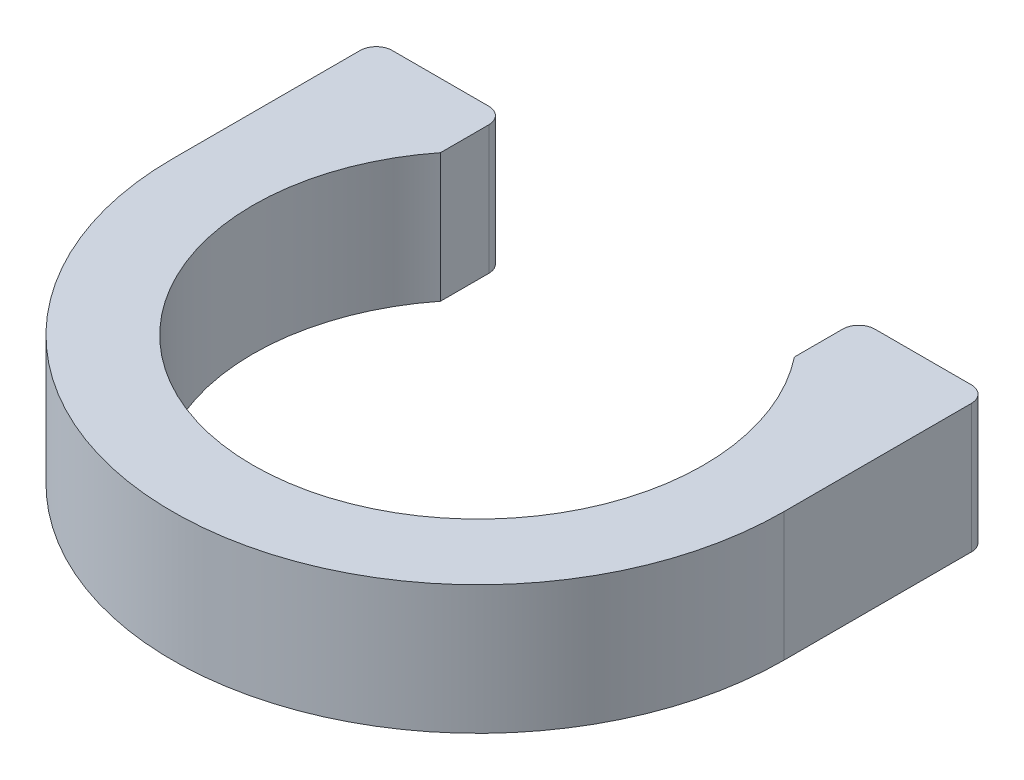
ISO-10303-21;
HEADER;
FILE_DESCRIPTION(('STEP AP214'),'2;1');
FILE_NAME('part.step','',(''),(''),'','','');
FILE_SCHEMA(('AUTOMOTIVE_DESIGN { 1 0 10303 214 1 1 1 1 }'));
ENDSEC;
DATA;
#1=APPLICATION_CONTEXT('core data for automotive mechanical design processes');
#2=APPLICATION_PROTOCOL_DEFINITION('international standard','automotive_design',2000,#1);
#3=PRODUCT_CONTEXT('',#1,'mechanical');
#4=PRODUCT('Part','Part','',(#3));
#5=PRODUCT_RELATED_PRODUCT_CATEGORY('part','',(#4));
#6=PRODUCT_DEFINITION_FORMATION('','',#4);
#7=PRODUCT_DEFINITION_CONTEXT('part definition',#1,'design');
#8=PRODUCT_DEFINITION('design','',#6,#7);
#9=PRODUCT_DEFINITION_SHAPE('','',#8);
#10=(LENGTH_UNIT() NAMED_UNIT(*) SI_UNIT(.MILLI.,.METRE.));
#11=(NAMED_UNIT(*) PLANE_ANGLE_UNIT() SI_UNIT($,.RADIAN.));
#12=(NAMED_UNIT(*) SI_UNIT($,.STERADIAN.) SOLID_ANGLE_UNIT());
#13=UNCERTAINTY_MEASURE_WITH_UNIT(LENGTH_MEASURE(1.E-05),#10,'distance_accuracy_value','');
#14=(GEOMETRIC_REPRESENTATION_CONTEXT(3) GLOBAL_UNCERTAINTY_ASSIGNED_CONTEXT((#13)) GLOBAL_UNIT_ASSIGNED_CONTEXT((#10,
#11,#12)) REPRESENTATION_CONTEXT('',''));
#15=CARTESIAN_POINT('',(0.,0.,0.));
#16=DIRECTION('',(0.,0.,1.));
#17=DIRECTION('',(1.,0.,0.));
#18=AXIS2_PLACEMENT_3D('',#15,#16,#17);
#19=CARTESIAN_POINT('',(-6.,4.,-7.4150635094611));
#20=DIRECTION('',(0.,-1.,0.));
#21=DIRECTION('',(0.,0.,-1.));
#22=AXIS2_PLACEMENT_3D('',#19,#20,#21);
#23=CYLINDRICAL_SURFACE('',#22,0.5);
#24=CARTESIAN_POINT('',(-6.,0.,-7.4150635094611));
#25=DIRECTION('',(0.,1.,0.));
#26=DIRECTION('',(0.,0.,1.));
#27=AXIS2_PLACEMENT_3D('',#24,#25,#26);
#28=CIRCLE('',#27,0.5);
#29=CARTESIAN_POINT('',(-6.,0.,-7.9150635094611));
#30=VERTEX_POINT('',#29);
#31=CARTESIAN_POINT('',(-5.5,0.,-7.41506350946109));
#32=VERTEX_POINT('',#31);
#33=EDGE_CURVE('E154',#30,#32,#28,.F.);
#34=ORIENTED_EDGE('',*,*,#33,.F.);
#35=DIRECTION('',(0.,-1.,0.));
#36=VECTOR('',#35,1.);
#37=CARTESIAN_POINT('',(-6.,4.,-7.9150635094611));
#38=LINE('',#37,#36);
#39=CARTESIAN_POINT('',(-6.,4.,-7.9150635094611));
#40=VERTEX_POINT('',#39);
#41=EDGE_CURVE('E11',#40,#30,#38,.T.);
#42=ORIENTED_EDGE('',*,*,#41,.F.);
#43=CARTESIAN_POINT('',(-6.,4.,-7.4150635094611));
#44=DIRECTION('',(0.,1.,0.));
#45=DIRECTION('',(0.,0.,1.));
#46=AXIS2_PLACEMENT_3D('',#43,#44,#45);
#47=CIRCLE('',#46,0.5);
#48=CARTESIAN_POINT('',(-5.5,4.,-7.41506350946109));
#49=VERTEX_POINT('',#48);
#50=EDGE_CURVE('E183',#40,#49,#47,.F.);
#51=ORIENTED_EDGE('',*,*,#50,.T.);
#52=DIRECTION('',(0.,-1.,0.));
#53=VECTOR('',#52,1.);
#54=CARTESIAN_POINT('',(-5.5,4.,-7.41506350946109));
#55=LINE('',#54,#53);
#56=EDGE_CURVE('E51',#49,#32,#55,.T.);
#57=ORIENTED_EDGE('',*,*,#56,.T.);
#58=EDGE_LOOP('',(#34,#42,#51,#57));
#59=FACE_BOUND('',#58,.T.);
#60=ADVANCED_FACE('F35',(#59),#23,.T.);
#61=CARTESIAN_POINT('',(0.,4.,-7.9150635094611));
#62=DIRECTION('',(0.,0.,1.));
#63=DIRECTION('',(1.,0.,0.));
#64=AXIS2_PLACEMENT_3D('',#61,#62,#63);
#65=PLANE('',#64);
#66=DIRECTION('',(-1.,0.,0.));
#67=VECTOR('',#66,1.);
#68=CARTESIAN_POINT('',(0.,0.,-7.9150635094611));
#69=LINE('',#68,#67);
#70=CARTESIAN_POINT('',(-9.,0.,-7.9150635094611));
#71=VERTEX_POINT('',#70);
#72=EDGE_CURVE('E156',#30,#71,#69,.T.);
#73=ORIENTED_EDGE('',*,*,#72,.T.);
#74=DIRECTION('',(0.,-1.,0.));
#75=VECTOR('',#74,1.);
#76=CARTESIAN_POINT('',(-9.,4.,-7.9150635094611));
#77=LINE('',#76,#75);
#78=CARTESIAN_POINT('',(-9.,4.,-7.9150635094611));
#79=VERTEX_POINT('',#78);
#80=EDGE_CURVE('E43',#79,#71,#77,.T.);
#81=ORIENTED_EDGE('',*,*,#80,.F.);
#82=DIRECTION('',(-1.,0.,0.));
#83=VECTOR('',#82,1.);
#84=CARTESIAN_POINT('',(0.,4.,-7.9150635094611));
#85=LINE('',#84,#83);
#86=EDGE_CURVE('E365',#40,#79,#85,.T.);
#87=ORIENTED_EDGE('',*,*,#86,.F.);
#88=ORIENTED_EDGE('',*,*,#41,.T.);
#89=EDGE_LOOP('',(#73,#81,#87,#88));
#90=FACE_BOUND('',#89,.T.);
#91=ADVANCED_FACE('F209',(#90),#65,.F.);
#92=CARTESIAN_POINT('',(-9.,4.,-7.4150635094611));
#93=DIRECTION('',(0.,-1.,0.));
#94=DIRECTION('',(0.,0.,-1.));
#95=AXIS2_PLACEMENT_3D('',#92,#93,#94);
#96=CYLINDRICAL_SURFACE('',#95,0.5);
#97=CARTESIAN_POINT('',(-9.,0.,-7.4150635094611));
#98=DIRECTION('',(0.,1.,0.));
#99=DIRECTION('',(0.,0.,1.));
#100=AXIS2_PLACEMENT_3D('',#97,#98,#99);
#101=CIRCLE('',#100,0.5);
#102=CARTESIAN_POINT('',(-9.5,0.,-7.41506350946109));
#103=VERTEX_POINT('',#102);
#104=EDGE_CURVE('E159',#103,#71,#101,.F.);
#105=ORIENTED_EDGE('',*,*,#104,.F.);
#106=DIRECTION('',(0.,-1.,0.));
#107=VECTOR('',#106,1.);
#108=CARTESIAN_POINT('',(-9.5,4.,-7.41506350946109));
#109=LINE('',#108,#107);
#110=CARTESIAN_POINT('',(-9.5,4.,-7.41506350946109));
#111=VERTEX_POINT('',#110);
#112=EDGE_CURVE('E199',#111,#103,#109,.T.);
#113=ORIENTED_EDGE('',*,*,#112,.F.);
#114=CARTESIAN_POINT('',(-9.,4.,-7.4150635094611));
#115=DIRECTION('',(0.,1.,0.));
#116=DIRECTION('',(0.,0.,1.));
#117=AXIS2_PLACEMENT_3D('',#114,#115,#116);
#118=CIRCLE('',#117,0.5);
#119=EDGE_CURVE('E206',#111,#79,#118,.F.);
#120=ORIENTED_EDGE('',*,*,#119,.T.);
#121=ORIENTED_EDGE('',*,*,#80,.T.);
#122=EDGE_LOOP('',(#105,#113,#120,#121));
#123=FACE_BOUND('',#122,.T.);
#124=ADVANCED_FACE('F204',(#123),#96,.T.);
#125=CARTESIAN_POINT('',(-9.5,4.,0.));
#126=DIRECTION('',(1.,0.,0.));
#127=DIRECTION('',(0.,0.,-1.));
#128=AXIS2_PLACEMENT_3D('',#125,#126,#127);
#129=PLANE('',#128);
#130=DIRECTION('',(0.,0.,1.));
#131=VECTOR('',#130,1.);
#132=CARTESIAN_POINT('',(-9.5,0.,0.));
#133=LINE('',#132,#131);
#134=CARTESIAN_POINT('',(-9.5,0.,-1.5849364905389));
#135=VERTEX_POINT('',#134);
#136=EDGE_CURVE('E162',#103,#135,#133,.T.);
#137=ORIENTED_EDGE('',*,*,#136,.T.);
#138=DIRECTION('',(0.,-1.,0.));
#139=VECTOR('',#138,1.);
#140=CARTESIAN_POINT('',(-9.5,4.,-1.5849364905389));
#141=LINE('',#140,#139);
#142=CARTESIAN_POINT('',(-9.5,4.,-1.5849364905389));
#143=VERTEX_POINT('',#142);
#144=EDGE_CURVE('E196',#143,#135,#141,.T.);
#145=ORIENTED_EDGE('',*,*,#144,.F.);
#146=DIRECTION('',(0.,0.,1.));
#147=VECTOR('',#146,1.);
#148=CARTESIAN_POINT('',(-9.5,4.,0.));
#149=LINE('',#148,#147);
#150=EDGE_CURVE('E226',#111,#143,#149,.T.);
#151=ORIENTED_EDGE('',*,*,#150,.F.);
#152=ORIENTED_EDGE('',*,*,#112,.T.);
#153=EDGE_LOOP('',(#137,#145,#151,#152));
#154=FACE_BOUND('',#153,.T.);
#155=ADVANCED_FACE('F217',(#154),#129,.F.);
#156=CARTESIAN_POINT('',(0.,4.,-1.5849364905389));
#157=DIRECTION('',(0.,-1.,0.));
#158=DIRECTION('',(0.,0.,-1.));
#159=AXIS2_PLACEMENT_3D('',#156,#157,#158);
#160=CYLINDRICAL_SURFACE('',#159,9.5);
#161=CARTESIAN_POINT('',(0.,0.,-1.5849364905389));
#162=DIRECTION('',(0.,1.,0.));
#163=DIRECTION('',(0.,0.,1.));
#164=AXIS2_PLACEMENT_3D('',#161,#162,#163);
#165=CIRCLE('',#164,9.5);
#166=CARTESIAN_POINT('',(9.5,0.,-1.5849364905389));
#167=VERTEX_POINT('',#166);
#168=EDGE_CURVE('E164',#135,#167,#165,.T.);
#169=ORIENTED_EDGE('',*,*,#168,.T.);
#170=DIRECTION('',(0.,-1.,0.));
#171=VECTOR('',#170,1.);
#172=CARTESIAN_POINT('',(9.5,4.,-1.5849364905389));
#173=LINE('',#172,#171);
#174=CARTESIAN_POINT('',(9.5,4.,-1.5849364905389));
#175=VERTEX_POINT('',#174);
#176=EDGE_CURVE('E193',#175,#167,#173,.T.);
#177=ORIENTED_EDGE('',*,*,#176,.F.);
#178=CARTESIAN_POINT('',(0.,4.,-1.5849364905389));
#179=DIRECTION('',(0.,1.,0.));
#180=DIRECTION('',(0.,0.,1.));
#181=AXIS2_PLACEMENT_3D('',#178,#179,#180);
#182=CIRCLE('',#181,9.5);
#183=EDGE_CURVE('E223',#143,#175,#182,.T.);
#184=ORIENTED_EDGE('',*,*,#183,.F.);
#185=ORIENTED_EDGE('',*,*,#144,.T.);
#186=EDGE_LOOP('',(#169,#177,#184,#185));
#187=FACE_BOUND('',#186,.T.);
#188=ADVANCED_FACE('F221',(#187),#160,.T.);
#189=CARTESIAN_POINT('',(9.5,4.,0.));
#190=DIRECTION('',(-1.,0.,0.));
#191=DIRECTION('',(0.,0.,1.));
#192=AXIS2_PLACEMENT_3D('',#189,#190,#191);
#193=PLANE('',#192);
#194=DIRECTION('',(0.,0.,-1.));
#195=VECTOR('',#194,1.);
#196=CARTESIAN_POINT('',(9.5,0.,0.));
#197=LINE('',#196,#195);
#198=CARTESIAN_POINT('',(9.5,0.,-7.41506350946109));
#199=VERTEX_POINT('',#198);
#200=EDGE_CURVE('E166',#167,#199,#197,.T.);
#201=ORIENTED_EDGE('',*,*,#200,.T.);
#202=DIRECTION('',(0.,-1.,0.));
#203=VECTOR('',#202,1.);
#204=CARTESIAN_POINT('',(9.5,4.,-7.41506350946109));
#205=LINE('',#204,#203);
#206=CARTESIAN_POINT('',(9.5,4.,-7.41506350946109));
#207=VERTEX_POINT('',#206);
#208=EDGE_CURVE('E191',#207,#199,#205,.T.);
#209=ORIENTED_EDGE('',*,*,#208,.F.);
#210=DIRECTION('',(0.,0.,-1.));
#211=VECTOR('',#210,1.);
#212=CARTESIAN_POINT('',(9.5,4.,0.));
#213=LINE('',#212,#211);
#214=EDGE_CURVE('E225',#175,#207,#213,.T.);
#215=ORIENTED_EDGE('',*,*,#214,.F.);
#216=ORIENTED_EDGE('',*,*,#176,.T.);
#217=EDGE_LOOP('',(#201,#209,#215,#216));
#218=FACE_BOUND('',#217,.T.);
#219=ADVANCED_FACE('F313',(#218),#193,.F.);
#220=CARTESIAN_POINT('',(9.,4.,-7.4150635094611));
#221=DIRECTION('',(0.,-1.,0.));
#222=DIRECTION('',(0.,0.,-1.));
#223=AXIS2_PLACEMENT_3D('',#220,#221,#222);
#224=CYLINDRICAL_SURFACE('',#223,0.5);
#225=CARTESIAN_POINT('',(9.,0.,-7.4150635094611));
#226=DIRECTION('',(0.,1.,0.));
#227=DIRECTION('',(0.,0.,1.));
#228=AXIS2_PLACEMENT_3D('',#225,#226,#227);
#229=CIRCLE('',#228,0.5);
#230=CARTESIAN_POINT('',(9.,0.,-7.9150635094611));
#231=VERTEX_POINT('',#230);
#232=EDGE_CURVE('E169',#231,#199,#229,.F.);
#233=ORIENTED_EDGE('',*,*,#232,.F.);
#234=DIRECTION('',(0.,-1.,0.));
#235=VECTOR('',#234,1.);
#236=CARTESIAN_POINT('',(9.,4.,-7.9150635094611));
#237=LINE('',#236,#235);
#238=CARTESIAN_POINT('',(9.,4.,-7.9150635094611));
#239=VERTEX_POINT('',#238);
#240=EDGE_CURVE('E189',#239,#231,#237,.T.);
#241=ORIENTED_EDGE('',*,*,#240,.F.);
#242=CARTESIAN_POINT('',(9.,4.,-7.4150635094611));
#243=DIRECTION('',(0.,1.,0.));
#244=DIRECTION('',(0.,0.,1.));
#245=AXIS2_PLACEMENT_3D('',#242,#243,#244);
#246=CIRCLE('',#245,0.5);
#247=EDGE_CURVE('E228',#239,#207,#246,.F.);
#248=ORIENTED_EDGE('',*,*,#247,.T.);
#249=ORIENTED_EDGE('',*,*,#208,.T.);
#250=EDGE_LOOP('',(#233,#241,#248,#249));
#251=FACE_BOUND('',#250,.T.);
#252=ADVANCED_FACE('F244',(#251),#224,.T.);
#253=CARTESIAN_POINT('',(0.,4.,-7.9150635094611));
#254=DIRECTION('',(0.,0.,-1.));
#255=DIRECTION('',(-1.,0.,0.));
#256=AXIS2_PLACEMENT_3D('',#253,#254,#255);
#257=PLANE('',#256);
#258=DIRECTION('',(1.,0.,0.));
#259=VECTOR('',#258,1.);
#260=CARTESIAN_POINT('',(0.,0.,-7.9150635094611));
#261=LINE('',#260,#259);
#262=CARTESIAN_POINT('',(6.,0.,-7.9150635094611));
#263=VERTEX_POINT('',#262);
#264=EDGE_CURVE('E172',#263,#231,#261,.T.);
#265=ORIENTED_EDGE('',*,*,#264,.F.);
#266=DIRECTION('',(0.,-1.,0.));
#267=VECTOR('',#266,1.);
#268=CARTESIAN_POINT('',(6.,4.,-7.9150635094611));
#269=LINE('',#268,#267);
#270=CARTESIAN_POINT('',(6.,4.,-7.9150635094611));
#271=VERTEX_POINT('',#270);
#272=EDGE_CURVE('E187',#271,#263,#269,.T.);
#273=ORIENTED_EDGE('',*,*,#272,.F.);
#274=DIRECTION('',(1.,0.,0.));
#275=VECTOR('',#274,1.);
#276=CARTESIAN_POINT('',(0.,4.,-7.9150635094611));
#277=LINE('',#276,#275);
#278=EDGE_CURVE('E235',#271,#239,#277,.T.);
#279=ORIENTED_EDGE('',*,*,#278,.T.);
#280=ORIENTED_EDGE('',*,*,#240,.T.);
#281=EDGE_LOOP('',(#265,#273,#279,#280));
#282=FACE_BOUND('',#281,.T.);
#283=ADVANCED_FACE('F239',(#282),#257,.T.);
#284=CARTESIAN_POINT('',(6.,4.,-7.4150635094611));
#285=DIRECTION('',(0.,-1.,0.));
#286=DIRECTION('',(0.,0.,-1.));
#287=AXIS2_PLACEMENT_3D('',#284,#285,#286);
#288=CYLINDRICAL_SURFACE('',#287,0.5);
#289=CARTESIAN_POINT('',(6.,0.,-7.4150635094611));
#290=DIRECTION('',(0.,1.,0.));
#291=DIRECTION('',(0.,0.,1.));
#292=AXIS2_PLACEMENT_3D('',#289,#290,#291);
#293=CIRCLE('',#292,0.5);
#294=CARTESIAN_POINT('',(5.5,0.,-7.41506350946109));
#295=VERTEX_POINT('',#294);
#296=EDGE_CURVE('E175',#263,#295,#293,.T.);
#297=ORIENTED_EDGE('',*,*,#296,.T.);
#298=DIRECTION('',(0.,-1.,0.));
#299=VECTOR('',#298,1.);
#300=CARTESIAN_POINT('',(5.5,4.,-7.41506350946109));
#301=LINE('',#300,#299);
#302=CARTESIAN_POINT('',(5.5,4.,-7.41506350946109));
#303=VERTEX_POINT('',#302);
#304=EDGE_CURVE('E146',#303,#295,#301,.T.);
#305=ORIENTED_EDGE('',*,*,#304,.F.);
#306=CARTESIAN_POINT('',(6.,4.,-7.4150635094611));
#307=DIRECTION('',(0.,1.,0.));
#308=DIRECTION('',(0.,0.,1.));
#309=AXIS2_PLACEMENT_3D('',#306,#307,#308);
#310=CIRCLE('',#309,0.5);
#311=EDGE_CURVE('E134',#271,#303,#310,.T.);
#312=ORIENTED_EDGE('',*,*,#311,.F.);
#313=ORIENTED_EDGE('',*,*,#272,.T.);
#314=EDGE_LOOP('',(#297,#305,#312,#313));
#315=FACE_BOUND('',#314,.T.);
#316=ADVANCED_FACE('F247',(#315),#288,.T.);
#317=CARTESIAN_POINT('',(5.5,4.,0.));
#318=DIRECTION('',(1.,0.,0.));
#319=DIRECTION('',(0.,0.,-1.));
#320=AXIS2_PLACEMENT_3D('',#317,#318,#319);
#321=PLANE('',#320);
#322=DIRECTION('',(0.,0.,1.));
#323=VECTOR('',#322,1.);
#324=CARTESIAN_POINT('',(5.5,0.,0.));
#325=LINE('',#324,#323);
#326=CARTESIAN_POINT('',(5.5,0.,-5.9150635094611));
#327=VERTEX_POINT('',#326);
#328=EDGE_CURVE('E143',#295,#327,#325,.T.);
#329=ORIENTED_EDGE('',*,*,#328,.T.);
#330=DIRECTION('',(0.,-1.,0.));
#331=VECTOR('',#330,1.);
#332=CARTESIAN_POINT('',(5.5,4.,-5.9150635094611));
#333=LINE('',#332,#331);
#334=CARTESIAN_POINT('',(5.5,4.,-5.9150635094611));
#335=VERTEX_POINT('',#334);
#336=EDGE_CURVE('E140',#335,#327,#333,.T.);
#337=ORIENTED_EDGE('',*,*,#336,.F.);
#338=DIRECTION('',(0.,0.,1.));
#339=VECTOR('',#338,1.);
#340=CARTESIAN_POINT('',(5.5,4.,0.));
#341=LINE('',#340,#339);
#342=EDGE_CURVE('E125',#303,#335,#341,.T.);
#343=ORIENTED_EDGE('',*,*,#342,.F.);
#344=ORIENTED_EDGE('',*,*,#304,.T.);
#345=EDGE_LOOP('',(#329,#337,#343,#344));
#346=FACE_BOUND('',#345,.T.);
#347=ADVANCED_FACE('F141',(#346),#321,.F.);
#348=CARTESIAN_POINT('',(0.,4.,-1.5849364905389));
#349=DIRECTION('',(0.,-1.,0.));
#350=DIRECTION('',(0.,0.,-1.));
#351=AXIS2_PLACEMENT_3D('',#348,#349,#350);
#352=CYLINDRICAL_SURFACE('',#351,7.);
#353=CARTESIAN_POINT('',(0.,0.,-1.5849364905389));
#354=DIRECTION('',(0.,1.,0.));
#355=DIRECTION('',(0.,0.,1.));
#356=AXIS2_PLACEMENT_3D('',#353,#354,#355);
#357=CIRCLE('',#356,7.);
#358=CARTESIAN_POINT('',(-5.5,0.,-5.9150635094611));
#359=VERTEX_POINT('',#358);
#360=EDGE_CURVE('E178',#359,#327,#357,.T.);
#361=ORIENTED_EDGE('',*,*,#360,.F.);
#362=DIRECTION('',(0.,-1.,0.));
#363=VECTOR('',#362,1.);
#364=CARTESIAN_POINT('',(-5.5,4.,-5.9150635094611));
#365=LINE('',#364,#363);
#366=CARTESIAN_POINT('',(-5.5,4.,-5.9150635094611));
#367=VERTEX_POINT('',#366);
#368=EDGE_CURVE('E88',#367,#359,#365,.T.);
#369=ORIENTED_EDGE('',*,*,#368,.F.);
#370=CARTESIAN_POINT('',(0.,4.,-1.5849364905389));
#371=DIRECTION('',(0.,1.,0.));
#372=DIRECTION('',(0.,0.,1.));
#373=AXIS2_PLACEMENT_3D('',#370,#371,#372);
#374=CIRCLE('',#373,7.);
#375=EDGE_CURVE('E131',#367,#335,#374,.T.);
#376=ORIENTED_EDGE('',*,*,#375,.T.);
#377=ORIENTED_EDGE('',*,*,#336,.T.);
#378=EDGE_LOOP('',(#361,#369,#376,#377));
#379=FACE_BOUND('',#378,.T.);
#380=ADVANCED_FACE('F148',(#379),#352,.F.);
#381=CARTESIAN_POINT('',(-5.5,4.,0.));
#382=DIRECTION('',(1.,0.,0.));
#383=DIRECTION('',(0.,0.,-1.));
#384=AXIS2_PLACEMENT_3D('',#381,#382,#383);
#385=PLANE('',#384);
#386=DIRECTION('',(0.,0.,1.));
#387=VECTOR('',#386,1.);
#388=CARTESIAN_POINT('',(-5.5,0.,0.));
#389=LINE('',#388,#387);
#390=EDGE_CURVE('E180',#32,#359,#389,.T.);
#391=ORIENTED_EDGE('',*,*,#390,.F.);
#392=ORIENTED_EDGE('',*,*,#56,.F.);
#393=DIRECTION('',(0.,0.,1.));
#394=VECTOR('',#393,1.);
#395=CARTESIAN_POINT('',(-5.5,4.,0.));
#396=LINE('',#395,#394);
#397=EDGE_CURVE('E149',#49,#367,#396,.T.);
#398=ORIENTED_EDGE('',*,*,#397,.T.);
#399=ORIENTED_EDGE('',*,*,#368,.T.);
#400=EDGE_LOOP('',(#391,#392,#398,#399));
#401=FACE_BOUND('',#400,.T.);
#402=ADVANCED_FACE('F260',(#401),#385,.T.);
#403=CARTESIAN_POINT('',(0.,4.,0.));
#404=DIRECTION('',(0.,1.,0.));
#405=DIRECTION('',(0.,0.,1.));
#406=AXIS2_PLACEMENT_3D('',#403,#404,#405);
#407=PLANE('',#406);
#408=ORIENTED_EDGE('',*,*,#50,.F.);
#409=ORIENTED_EDGE('',*,*,#86,.T.);
#410=ORIENTED_EDGE('',*,*,#119,.F.);
#411=ORIENTED_EDGE('',*,*,#150,.T.);
#412=ORIENTED_EDGE('',*,*,#183,.T.);
#413=ORIENTED_EDGE('',*,*,#214,.T.);
#414=ORIENTED_EDGE('',*,*,#247,.F.);
#415=ORIENTED_EDGE('',*,*,#278,.F.);
#416=ORIENTED_EDGE('',*,*,#311,.T.);
#417=ORIENTED_EDGE('',*,*,#342,.T.);
#418=ORIENTED_EDGE('',*,*,#375,.F.);
#419=ORIENTED_EDGE('',*,*,#397,.F.);
#420=EDGE_LOOP('',(#408,#409,#410,#411,#412,#413,#414,#415,#416,#417,#418,#419));
#421=FACE_BOUND('',#420,.T.);
#422=ADVANCED_FACE('F128',(#421),#407,.T.);
#423=CARTESIAN_POINT('',(0.,0.,0.));
#424=DIRECTION('',(0.,1.,0.));
#425=DIRECTION('',(0.,0.,1.));
#426=AXIS2_PLACEMENT_3D('',#423,#424,#425);
#427=PLANE('',#426);
#428=ORIENTED_EDGE('',*,*,#33,.T.);
#429=ORIENTED_EDGE('',*,*,#390,.T.);
#430=ORIENTED_EDGE('',*,*,#360,.T.);
#431=ORIENTED_EDGE('',*,*,#328,.F.);
#432=ORIENTED_EDGE('',*,*,#296,.F.);
#433=ORIENTED_EDGE('',*,*,#264,.T.);
#434=ORIENTED_EDGE('',*,*,#232,.T.);
#435=ORIENTED_EDGE('',*,*,#200,.F.);
#436=ORIENTED_EDGE('',*,*,#168,.F.);
#437=ORIENTED_EDGE('',*,*,#136,.F.);
#438=ORIENTED_EDGE('',*,*,#104,.T.);
#439=ORIENTED_EDGE('',*,*,#72,.F.);
#440=EDGE_LOOP('',(#428,#429,#430,#431,#432,#433,#434,#435,#436,#437,#438,#439));
#441=FACE_BOUND('',#440,.T.);
#442=ADVANCED_FACE('F212',(#441),#427,.F.);
#443=CLOSED_SHELL('',(#60,#91,#124,#155,#188,#219,#252,#283,#316,#347,#380,#402,#422,#442));
#444=MANIFOLD_SOLID_BREP('B2',#443);
#445=ADVANCED_BREP_SHAPE_REPRESENTATION('',(#18,#444),#14);
#446=SHAPE_DEFINITION_REPRESENTATION(#9,#445);
ENDSEC;
END-ISO-10303-21;
